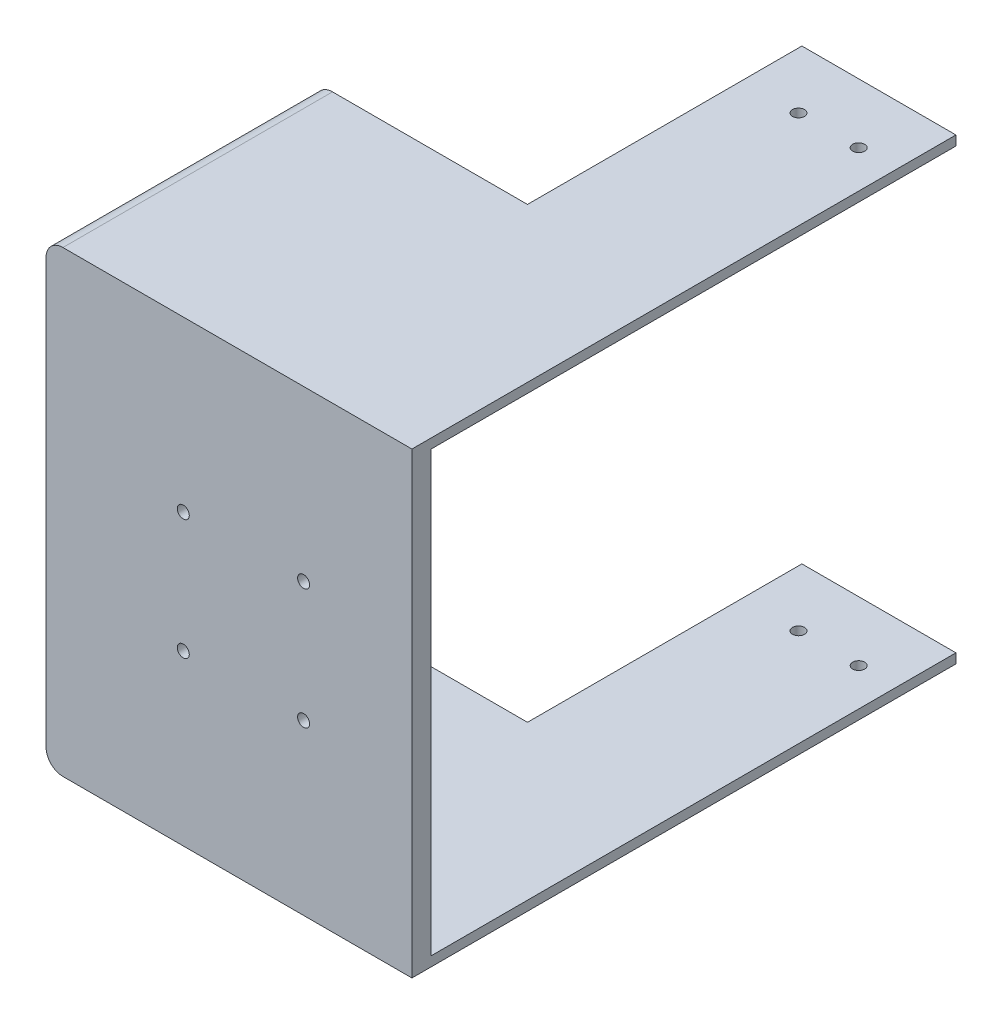
ISO-10303-21;
HEADER;
FILE_DESCRIPTION(('STEP AP214'),'2;1');
FILE_NAME('part.step','',(''),(''),'','','');
FILE_SCHEMA(('AUTOMOTIVE_DESIGN { 1 0 10303 214 1 1 1 1 }'));
ENDSEC;
DATA;
#1=APPLICATION_CONTEXT('core data for automotive mechanical design processes');
#2=APPLICATION_PROTOCOL_DEFINITION('international standard','automotive_design',2000,#1);
#3=PRODUCT_CONTEXT('',#1,'mechanical');
#4=PRODUCT('Part','Part','',(#3));
#5=PRODUCT_RELATED_PRODUCT_CATEGORY('part','',(#4));
#6=PRODUCT_DEFINITION_FORMATION('','',#4);
#7=PRODUCT_DEFINITION_CONTEXT('part definition',#1,'design');
#8=PRODUCT_DEFINITION('design','',#6,#7);
#9=PRODUCT_DEFINITION_SHAPE('','',#8);
#10=(LENGTH_UNIT() NAMED_UNIT(*) SI_UNIT(.MILLI.,.METRE.));
#11=(NAMED_UNIT(*) PLANE_ANGLE_UNIT() SI_UNIT($,.RADIAN.));
#12=(NAMED_UNIT(*) SI_UNIT($,.STERADIAN.) SOLID_ANGLE_UNIT());
#13=UNCERTAINTY_MEASURE_WITH_UNIT(LENGTH_MEASURE(1.E-05),#10,'distance_accuracy_value','');
#14=(GEOMETRIC_REPRESENTATION_CONTEXT(3) GLOBAL_UNCERTAINTY_ASSIGNED_CONTEXT((#13)) GLOBAL_UNIT_ASSIGNED_CONTEXT((#10,
#11,#12)) REPRESENTATION_CONTEXT('',''));
#15=CARTESIAN_POINT('',(0.,0.,0.));
#16=DIRECTION('',(0.,0.,1.));
#17=DIRECTION('',(1.,0.,0.));
#18=AXIS2_PLACEMENT_3D('',#15,#16,#17);
#19=CARTESIAN_POINT('',(42.,47.58,-56.));
#20=DIRECTION('',(0.,0.,1.));
#21=DIRECTION('',(0.,-1.,0.));
#22=AXIS2_PLACEMENT_3D('',#19,#20,#21);
#23=PLANE('',#22);
#24=DIRECTION('',(-1.,0.,0.));
#25=VECTOR('',#24,1.);
#26=CARTESIAN_POINT('',(42.,-47.58,-56.));
#27=LINE('',#26,#25);
#28=CARTESIAN_POINT('',(42.,-47.58,-56.));
#29=VERTEX_POINT('',#28);
#30=CARTESIAN_POINT('',(1.50000000000002,-47.58,-56.));
#31=VERTEX_POINT('',#30);
#32=EDGE_CURVE('E178',#29,#31,#27,.T.);
#33=ORIENTED_EDGE('',*,*,#32,.T.);
#34=DIRECTION('',(0.,1.,0.));
#35=VECTOR('',#34,1.);
#36=CARTESIAN_POINT('',(1.50000000000002,-47.58,-56.));
#37=LINE('',#36,#35);
#38=CARTESIAN_POINT('',(1.50000000000001,-45.58,-56.));
#39=VERTEX_POINT('',#38);
#40=EDGE_CURVE('E11',#31,#39,#37,.T.);
#41=ORIENTED_EDGE('',*,*,#40,.T.);
#42=DIRECTION('',(-1.,0.,0.));
#43=VECTOR('',#42,1.);
#44=CARTESIAN_POINT('',(0.,-45.58,-56.));
#45=LINE('',#44,#43);
#46=CARTESIAN_POINT('',(42.,-45.58,-56.));
#47=VERTEX_POINT('',#46);
#48=EDGE_CURVE('E181',#47,#39,#45,.T.);
#49=ORIENTED_EDGE('',*,*,#48,.F.);
#50=DIRECTION('',(0.,1.,0.));
#51=VECTOR('',#50,1.);
#52=CARTESIAN_POINT('',(42.,47.58,-56.));
#53=LINE('',#52,#51);
#54=EDGE_CURVE('E168',#29,#47,#53,.T.);
#55=ORIENTED_EDGE('',*,*,#54,.F.);
#56=EDGE_LOOP('',(#33,#41,#49,#55));
#57=FACE_BOUND('',#56,.T.);
#58=ADVANCED_FACE('F40',(#57),#23,.F.);
#59=DIRECTION('',(0.,1.,0.));
#60=VECTOR('',#59,1.);
#61=CARTESIAN_POINT('',(0.,45.58,-56.));
#62=LINE('',#61,#60);
#63=CARTESIAN_POINT('',(0.,-44.08,-56.));
#64=VERTEX_POINT('',#63);
#65=CARTESIAN_POINT('',(0.,44.08,-56.));
#66=VERTEX_POINT('',#65);
#67=EDGE_CURVE('E212',#64,#66,#62,.T.);
#68=ORIENTED_EDGE('',*,*,#67,.F.);
#69=DIRECTION('',(-1.,0.,0.));
#70=VECTOR('',#69,1.);
#71=CARTESIAN_POINT('',(0.,-44.08,-56.));
#72=LINE('',#71,#70);
#73=CARTESIAN_POINT('',(-1.99999999999999,-44.08,-56.));
#74=VERTEX_POINT('',#73);
#75=EDGE_CURVE('E48',#64,#74,#72,.T.);
#76=ORIENTED_EDGE('',*,*,#75,.T.);
#77=DIRECTION('',(0.,1.,0.));
#78=VECTOR('',#77,1.);
#79=CARTESIAN_POINT('',(-2.00000000000002,47.58,-56.));
#80=LINE('',#79,#78);
#81=CARTESIAN_POINT('',(-2.00000000000002,44.08,-56.));
#82=VERTEX_POINT('',#81);
#83=EDGE_CURVE('E174',#74,#82,#80,.T.);
#84=ORIENTED_EDGE('',*,*,#83,.T.);
#85=DIRECTION('',(1.,0.,0.));
#86=VECTOR('',#85,1.);
#87=CARTESIAN_POINT('',(-2.00000000000002,44.08,-56.));
#88=LINE('',#87,#86);
#89=EDGE_CURVE('E330',#82,#66,#88,.T.);
#90=ORIENTED_EDGE('',*,*,#89,.T.);
#91=EDGE_LOOP('',(#68,#76,#84,#90));
#92=FACE_BOUND('',#91,.T.);
#93=ADVANCED_FACE('F334',(#92),#23,.F.);
#94=ORIENTED_EDGE('',*,*,#40,.F.);
#95=CARTESIAN_POINT('',(1.50000000000001,-44.08,-56.));
#96=DIRECTION('',(0.,0.,1.));
#97=DIRECTION('',(0.,-1.,0.));
#98=AXIS2_PLACEMENT_3D('',#95,#96,#97);
#99=CIRCLE('',#98,3.5);
#100=EDGE_CURVE('E205',#31,#74,#99,.F.);
#101=ORIENTED_EDGE('',*,*,#100,.T.);
#102=ORIENTED_EDGE('',*,*,#75,.F.);
#103=CARTESIAN_POINT('',(1.50000000000001,-44.08,-56.));
#104=DIRECTION('',(0.,0.,1.));
#105=DIRECTION('',(0.,-1.,0.));
#106=AXIS2_PLACEMENT_3D('',#103,#104,#105);
#107=CIRCLE('',#106,1.5);
#108=EDGE_CURVE('E209',#39,#64,#107,.F.);
#109=ORIENTED_EDGE('',*,*,#108,.F.);
#110=EDGE_LOOP('',(#94,#101,#102,#109));
#111=FACE_BOUND('',#110,.T.);
#112=ADVANCED_FACE('F339',(#111),#23,.F.);
#113=DIRECTION('',(1.,0.,0.));
#114=VECTOR('',#113,1.);
#115=CARTESIAN_POINT('',(0.,45.58,-56.));
#116=LINE('',#115,#114);
#117=CARTESIAN_POINT('',(1.49999999999998,45.58,-56.));
#118=VERTEX_POINT('',#117);
#119=CARTESIAN_POINT('',(42.,45.58,-56.));
#120=VERTEX_POINT('',#119);
#121=EDGE_CURVE('E218',#118,#120,#116,.T.);
#122=ORIENTED_EDGE('',*,*,#121,.F.);
#123=DIRECTION('',(0.,1.,0.));
#124=VECTOR('',#123,1.);
#125=CARTESIAN_POINT('',(1.49999999999998,45.58,-56.));
#126=LINE('',#125,#124);
#127=CARTESIAN_POINT('',(1.49999999999999,47.58,-56.));
#128=VERTEX_POINT('',#127);
#129=EDGE_CURVE('E328',#118,#128,#126,.T.);
#130=ORIENTED_EDGE('',*,*,#129,.T.);
#131=DIRECTION('',(-1.,0.,0.));
#132=VECTOR('',#131,1.);
#133=CARTESIAN_POINT('',(42.,47.58,-56.));
#134=LINE('',#133,#132);
#135=CARTESIAN_POINT('',(42.,47.58,-56.));
#136=VERTEX_POINT('',#135);
#137=EDGE_CURVE('E189',#136,#128,#134,.T.);
#138=ORIENTED_EDGE('',*,*,#137,.F.);
#139=EDGE_CURVE('E173',#120,#136,#53,.T.);
#140=ORIENTED_EDGE('',*,*,#139,.F.);
#141=EDGE_LOOP('',(#122,#130,#138,#140));
#142=FACE_BOUND('',#141,.T.);
#143=ADVANCED_FACE('F368',(#142),#23,.F.);
#144=CARTESIAN_POINT('',(0.,45.58,-113.));
#145=DIRECTION('',(0.,1.,0.));
#146=DIRECTION('',(0.,0.,1.));
#147=AXIS2_PLACEMENT_3D('',#144,#145,#146);
#148=PLANE('',#147);
#149=CARTESIAN_POINT('',(53.7,45.58,-100.6));
#150=DIRECTION('',(0.,1.,0.));
#151=DIRECTION('',(0.,0.,1.));
#152=AXIS2_PLACEMENT_3D('',#149,#150,#151);
#153=CIRCLE('',#152,1.24999999999999);
#154=CARTESIAN_POINT('',(53.7,45.58,-99.35));
#155=VERTEX_POINT('',#154);
#156=EDGE_CURVE('E230',#155,#155,#153,.T.);
#157=ORIENTED_EDGE('',*,*,#156,.T.);
#158=EDGE_LOOP('',(#157));
#159=FACE_BOUND('',#158,.T.);
#160=CARTESIAN_POINT('',(66.2,45.58,-100.6));
#161=DIRECTION('',(0.,1.,0.));
#162=DIRECTION('',(0.,0.,1.));
#163=AXIS2_PLACEMENT_3D('',#160,#161,#162);
#164=CIRCLE('',#163,1.24999999999999);
#165=CARTESIAN_POINT('',(66.2,45.58,-99.35));
#166=VERTEX_POINT('',#165);
#167=EDGE_CURVE('E242',#166,#166,#164,.T.);
#168=ORIENTED_EDGE('',*,*,#167,.T.);
#169=EDGE_LOOP('',(#168));
#170=FACE_BOUND('',#169,.T.);
#171=DIRECTION('',(0.,0.,1.));
#172=VECTOR('',#171,1.);
#173=CARTESIAN_POINT('',(1.49999999999998,45.58,-113.));
#174=LINE('',#173,#172);
#175=CARTESIAN_POINT('',(1.49999999999998,45.58,-4.));
#176=VERTEX_POINT('',#175);
#177=EDGE_CURVE('E305',#118,#176,#174,.T.);
#178=ORIENTED_EDGE('',*,*,#177,.F.);
#179=ORIENTED_EDGE('',*,*,#121,.T.);
#180=DIRECTION('',(0.,0.,-1.));
#181=VECTOR('',#180,1.);
#182=CARTESIAN_POINT('',(42.,45.58,-113.));
#183=LINE('',#182,#181);
#184=CARTESIAN_POINT('',(42.,45.58,-113.));
#185=VERTEX_POINT('',#184);
#186=EDGE_CURVE('E199',#120,#185,#183,.T.);
#187=ORIENTED_EDGE('',*,*,#186,.T.);
#188=DIRECTION('',(-1.,0.,0.));
#189=VECTOR('',#188,1.);
#190=CARTESIAN_POINT('',(0.,45.58,-113.));
#191=LINE('',#190,#189);
#192=CARTESIAN_POINT('',(74.,45.58,-113.));
#193=VERTEX_POINT('',#192);
#194=EDGE_CURVE('E270',#193,#185,#191,.T.);
#195=ORIENTED_EDGE('',*,*,#194,.F.);
#196=DIRECTION('',(0.,0.,1.));
#197=VECTOR('',#196,1.);
#198=CARTESIAN_POINT('',(74.,45.58,-113.));
#199=LINE('',#198,#197);
#200=CARTESIAN_POINT('',(74.,45.58,-4.));
#201=VERTEX_POINT('',#200);
#202=EDGE_CURVE('E63',#193,#201,#199,.T.);
#203=ORIENTED_EDGE('',*,*,#202,.T.);
#204=DIRECTION('',(-1.,0.,0.));
#205=VECTOR('',#204,1.);
#206=CARTESIAN_POINT('',(74.,45.58,-4.));
#207=LINE('',#206,#205);
#208=EDGE_CURVE('E248',#201,#176,#207,.T.);
#209=ORIENTED_EDGE('',*,*,#208,.T.);
#210=EDGE_LOOP('',(#178,#179,#187,#195,#203,#209));
#211=FACE_BOUND('',#210,.T.);
#212=ADVANCED_FACE('F404',(#159,#170,#211),#148,.F.);
#213=CARTESIAN_POINT('',(1.49999999999998,44.08,-113.));
#214=DIRECTION('',(0.,0.,1.));
#215=DIRECTION('',(1.,0.,0.));
#216=AXIS2_PLACEMENT_3D('',#213,#214,#215);
#217=CYLINDRICAL_SURFACE('',#216,1.5);
#218=DIRECTION('',(0.,0.,1.));
#219=VECTOR('',#218,1.);
#220=CARTESIAN_POINT('',(0.,44.08,-113.));
#221=LINE('',#220,#219);
#222=CARTESIAN_POINT('',(0.,44.08,-4.));
#223=VERTEX_POINT('',#222);
#224=EDGE_CURVE('E307',#66,#223,#221,.T.);
#225=ORIENTED_EDGE('',*,*,#224,.F.);
#226=CARTESIAN_POINT('',(1.49999999999998,44.08,-56.));
#227=DIRECTION('',(0.,0.,1.));
#228=DIRECTION('',(0.,-1.,0.));
#229=AXIS2_PLACEMENT_3D('',#226,#227,#228);
#230=CIRCLE('',#229,1.5);
#231=EDGE_CURVE('E215',#66,#118,#230,.F.);
#232=ORIENTED_EDGE('',*,*,#231,.T.);
#233=ORIENTED_EDGE('',*,*,#177,.T.);
#234=CARTESIAN_POINT('',(1.49999999999998,44.08,-4.));
#235=DIRECTION('',(0.,0.,1.));
#236=DIRECTION('',(1.,0.,0.));
#237=AXIS2_PLACEMENT_3D('',#234,#235,#236);
#238=CIRCLE('',#237,1.5);
#239=EDGE_CURVE('E250',#176,#223,#238,.T.);
#240=ORIENTED_EDGE('',*,*,#239,.T.);
#241=EDGE_LOOP('',(#225,#232,#233,#240));
#242=FACE_BOUND('',#241,.T.);
#243=ADVANCED_FACE('F378',(#242),#217,.F.);
#244=CARTESIAN_POINT('',(0.,45.58,-113.));
#245=DIRECTION('',(-1.,0.,0.));
#246=DIRECTION('',(0.,-1.,0.));
#247=AXIS2_PLACEMENT_3D('',#244,#245,#246);
#248=PLANE('',#247);
#249=DIRECTION('',(0.,0.,1.));
#250=VECTOR('',#249,1.);
#251=CARTESIAN_POINT('',(0.,-44.08,-113.));
#252=LINE('',#251,#250);
#253=CARTESIAN_POINT('',(0.,-44.08,-4.));
#254=VERTEX_POINT('',#253);
#255=EDGE_CURVE('E309',#64,#254,#252,.T.);
#256=ORIENTED_EDGE('',*,*,#255,.F.);
#257=ORIENTED_EDGE('',*,*,#67,.T.);
#258=ORIENTED_EDGE('',*,*,#224,.T.);
#259=DIRECTION('',(0.,-1.,0.));
#260=VECTOR('',#259,1.);
#261=CARTESIAN_POINT('',(0.,44.08,-4.));
#262=LINE('',#261,#260);
#263=EDGE_CURVE('E253',#223,#254,#262,.T.);
#264=ORIENTED_EDGE('',*,*,#263,.T.);
#265=EDGE_LOOP('',(#256,#257,#258,#264));
#266=FACE_BOUND('',#265,.T.);
#267=ADVANCED_FACE('F377',(#266),#248,.F.);
#268=CARTESIAN_POINT('',(1.50000000000001,-44.08,-113.));
#269=DIRECTION('',(0.,0.,1.));
#270=DIRECTION('',(1.,0.,0.));
#271=AXIS2_PLACEMENT_3D('',#268,#269,#270);
#272=CYLINDRICAL_SURFACE('',#271,1.5);
#273=DIRECTION('',(0.,0.,1.));
#274=VECTOR('',#273,1.);
#275=CARTESIAN_POINT('',(1.50000000000001,-45.58,-113.));
#276=LINE('',#275,#274);
#277=CARTESIAN_POINT('',(1.50000000000001,-45.58,-4.));
#278=VERTEX_POINT('',#277);
#279=EDGE_CURVE('E311',#39,#278,#276,.T.);
#280=ORIENTED_EDGE('',*,*,#279,.F.);
#281=ORIENTED_EDGE('',*,*,#108,.T.);
#282=ORIENTED_EDGE('',*,*,#255,.T.);
#283=CARTESIAN_POINT('',(1.50000000000001,-44.08,-4.));
#284=DIRECTION('',(0.,0.,1.));
#285=DIRECTION('',(1.,0.,0.));
#286=AXIS2_PLACEMENT_3D('',#283,#284,#285);
#287=CIRCLE('',#286,1.5);
#288=EDGE_CURVE('E256',#254,#278,#287,.T.);
#289=ORIENTED_EDGE('',*,*,#288,.T.);
#290=EDGE_LOOP('',(#280,#281,#282,#289));
#291=FACE_BOUND('',#290,.T.);
#292=ADVANCED_FACE('F388',(#291),#272,.F.);
#293=CARTESIAN_POINT('',(0.,-45.58,-113.));
#294=DIRECTION('',(0.,-1.,0.));
#295=DIRECTION('',(0.,0.,-1.));
#296=AXIS2_PLACEMENT_3D('',#293,#294,#295);
#297=PLANE('',#296);
#298=CARTESIAN_POINT('',(53.7,-45.58,-100.6));
#299=DIRECTION('',(0.,-1.,0.));
#300=DIRECTION('',(0.,0.,-1.));
#301=AXIS2_PLACEMENT_3D('',#298,#299,#300);
#302=CIRCLE('',#301,1.24999999999999);
#303=CARTESIAN_POINT('',(53.7,-45.58,-101.85));
#304=VERTEX_POINT('',#303);
#305=EDGE_CURVE('E227',#304,#304,#302,.T.);
#306=ORIENTED_EDGE('',*,*,#305,.T.);
#307=EDGE_LOOP('',(#306));
#308=FACE_BOUND('',#307,.T.);
#309=CARTESIAN_POINT('',(66.2,-45.58,-100.6));
#310=DIRECTION('',(0.,-1.,0.));
#311=DIRECTION('',(0.,0.,-1.));
#312=AXIS2_PLACEMENT_3D('',#309,#310,#311);
#313=CIRCLE('',#312,1.24999999999999);
#314=CARTESIAN_POINT('',(66.2,-45.58,-101.85));
#315=VERTEX_POINT('',#314);
#316=EDGE_CURVE('E239',#315,#315,#313,.T.);
#317=ORIENTED_EDGE('',*,*,#316,.T.);
#318=EDGE_LOOP('',(#317));
#319=FACE_BOUND('',#318,.T.);
#320=DIRECTION('',(0.,0.,1.));
#321=VECTOR('',#320,1.);
#322=CARTESIAN_POINT('',(42.,-45.58,-113.));
#323=LINE('',#322,#321);
#324=CARTESIAN_POINT('',(42.,-45.58,-113.));
#325=VERTEX_POINT('',#324);
#326=EDGE_CURVE('E55',#325,#47,#323,.T.);
#327=ORIENTED_EDGE('',*,*,#326,.T.);
#328=ORIENTED_EDGE('',*,*,#48,.T.);
#329=ORIENTED_EDGE('',*,*,#279,.T.);
#330=DIRECTION('',(1.,0.,0.));
#331=VECTOR('',#330,1.);
#332=CARTESIAN_POINT('',(1.50000000000001,-45.58,-4.));
#333=LINE('',#332,#331);
#334=CARTESIAN_POINT('',(74.,-45.58,-4.));
#335=VERTEX_POINT('',#334);
#336=EDGE_CURVE('E259',#278,#335,#333,.T.);
#337=ORIENTED_EDGE('',*,*,#336,.T.);
#338=DIRECTION('',(0.,0.,1.));
#339=VECTOR('',#338,1.);
#340=CARTESIAN_POINT('',(74.,-45.58,-113.));
#341=LINE('',#340,#339);
#342=CARTESIAN_POINT('',(74.,-45.58,-113.));
#343=VERTEX_POINT('',#342);
#344=EDGE_CURVE('E313',#343,#335,#341,.T.);
#345=ORIENTED_EDGE('',*,*,#344,.F.);
#346=DIRECTION('',(1.,0.,0.));
#347=VECTOR('',#346,1.);
#348=CARTESIAN_POINT('',(0.,-45.58,-113.));
#349=LINE('',#348,#347);
#350=EDGE_CURVE('E268',#325,#343,#349,.T.);
#351=ORIENTED_EDGE('',*,*,#350,.F.);
#352=EDGE_LOOP('',(#327,#328,#329,#337,#345,#351));
#353=FACE_BOUND('',#352,.T.);
#354=ADVANCED_FACE('F390',(#308,#319,#353),#297,.F.);
#355=CARTESIAN_POINT('',(-2.00000000000002,44.08,-113.));
#356=DIRECTION('',(0.,0.,-1.));
#357=DIRECTION('',(-1.,0.,0.));
#358=AXIS2_PLACEMENT_3D('',#355,#356,#357);
#359=PLANE('',#358);
#360=DIRECTION('',(0.,-1.,0.));
#361=VECTOR('',#360,1.);
#362=CARTESIAN_POINT('',(42.,44.08,-113.));
#363=LINE('',#362,#361);
#364=CARTESIAN_POINT('',(42.,47.58,-113.));
#365=VERTEX_POINT('',#364);
#366=EDGE_CURVE('E197',#365,#185,#363,.T.);
#367=ORIENTED_EDGE('',*,*,#366,.F.);
#368=DIRECTION('',(1.,0.,0.));
#369=VECTOR('',#368,1.);
#370=CARTESIAN_POINT('',(0.,47.58,-113.));
#371=LINE('',#370,#369);
#372=CARTESIAN_POINT('',(74.,47.58,-113.));
#373=VERTEX_POINT('',#372);
#374=EDGE_CURVE('E275',#373,#365,#371,.F.);
#375=ORIENTED_EDGE('',*,*,#374,.F.);
#376=DIRECTION('',(0.,-1.,0.));
#377=VECTOR('',#376,1.);
#378=CARTESIAN_POINT('',(74.,47.58,-113.));
#379=LINE('',#378,#377);
#380=EDGE_CURVE('E273',#373,#193,#379,.T.);
#381=ORIENTED_EDGE('',*,*,#380,.T.);
#382=ORIENTED_EDGE('',*,*,#194,.T.);
#383=EDGE_LOOP('',(#367,#375,#381,#382));
#384=FACE_BOUND('',#383,.T.);
#385=ADVANCED_FACE('F42',(#384),#359,.T.);
#386=CARTESIAN_POINT('',(0.,-47.58,-113.));
#387=DIRECTION('',(0.,-1.,0.));
#388=DIRECTION('',(0.,0.,-1.));
#389=AXIS2_PLACEMENT_3D('',#386,#387,#388);
#390=PLANE('',#389);
#391=ORIENTED_EDGE('',*,*,#32,.F.);
#392=DIRECTION('',(0.,0.,1.));
#393=VECTOR('',#392,1.);
#394=CARTESIAN_POINT('',(42.,-47.58,-56.));
#395=LINE('',#394,#393);
#396=CARTESIAN_POINT('',(42.,-47.58,-113.));
#397=VERTEX_POINT('',#396);
#398=EDGE_CURVE('E165',#397,#29,#395,.T.);
#399=ORIENTED_EDGE('',*,*,#398,.F.);
#400=DIRECTION('',(1.,0.,0.));
#401=VECTOR('',#400,1.);
#402=CARTESIAN_POINT('',(0.,-47.58,-113.));
#403=LINE('',#402,#401);
#404=CARTESIAN_POINT('',(74.,-47.58,-113.));
#405=VERTEX_POINT('',#404);
#406=EDGE_CURVE('E262',#397,#405,#403,.T.);
#407=ORIENTED_EDGE('',*,*,#406,.T.);
#408=DIRECTION('',(0.,0.,1.));
#409=VECTOR('',#408,1.);
#410=CARTESIAN_POINT('',(74.,-47.58,-113.));
#411=LINE('',#410,#409);
#412=CARTESIAN_POINT('',(74.,-47.58,0.));
#413=VERTEX_POINT('',#412);
#414=EDGE_CURVE('E278',#405,#413,#411,.T.);
#415=ORIENTED_EDGE('',*,*,#414,.T.);
#416=DIRECTION('',(1.,0.,0.));
#417=VECTOR('',#416,1.);
#418=CARTESIAN_POINT('',(0.,-47.58,0.));
#419=LINE('',#418,#417);
#420=CARTESIAN_POINT('',(1.50000000000001,-47.58,0.));
#421=VERTEX_POINT('',#420);
#422=EDGE_CURVE('E261',#421,#413,#419,.T.);
#423=ORIENTED_EDGE('',*,*,#422,.F.);
#424=DIRECTION('',(0.,0.,1.));
#425=VECTOR('',#424,1.);
#426=CARTESIAN_POINT('',(1.50000000000001,-47.58,-113.));
#427=LINE('',#426,#425);
#428=EDGE_CURVE('E188',#31,#421,#427,.T.);
#429=ORIENTED_EDGE('',*,*,#428,.F.);
#430=EDGE_LOOP('',(#391,#399,#407,#415,#423,#429));
#431=FACE_BOUND('',#430,.T.);
#432=CARTESIAN_POINT('',(53.7,-47.58,-100.6));
#433=DIRECTION('',(0.,1.,0.));
#434=DIRECTION('',(0.,0.,1.));
#435=AXIS2_PLACEMENT_3D('',#432,#433,#434);
#436=CIRCLE('',#435,1.24999999999999);
#437=CARTESIAN_POINT('',(53.7,-47.58,-99.35));
#438=VERTEX_POINT('',#437);
#439=EDGE_CURVE('E224',#438,#438,#436,.T.);
#440=ORIENTED_EDGE('',*,*,#439,.T.);
#441=EDGE_LOOP('',(#440));
#442=FACE_BOUND('',#441,.T.);
#443=CARTESIAN_POINT('',(66.2,-47.58,-100.6));
#444=DIRECTION('',(0.,1.,0.));
#445=DIRECTION('',(0.,0.,1.));
#446=AXIS2_PLACEMENT_3D('',#443,#444,#445);
#447=CIRCLE('',#446,1.24999999999999);
#448=CARTESIAN_POINT('',(66.2,-47.58,-99.35));
#449=VERTEX_POINT('',#448);
#450=EDGE_CURVE('E236',#449,#449,#447,.T.);
#451=ORIENTED_EDGE('',*,*,#450,.T.);
#452=EDGE_LOOP('',(#451));
#453=FACE_BOUND('',#452,.T.);
#454=ADVANCED_FACE('F185',(#431,#442,#453),#390,.T.);
#455=CARTESIAN_POINT('',(1.50000000000001,-44.08,-113.));
#456=DIRECTION('',(0.,0.,1.));
#457=DIRECTION('',(1.,0.,0.));
#458=AXIS2_PLACEMENT_3D('',#455,#456,#457);
#459=CYLINDRICAL_SURFACE('',#458,3.5);
#460=ORIENTED_EDGE('',*,*,#100,.F.);
#461=ORIENTED_EDGE('',*,*,#428,.T.);
#462=CARTESIAN_POINT('',(1.50000000000001,-44.08,0.));
#463=DIRECTION('',(0.,0.,1.));
#464=DIRECTION('',(1.,0.,0.));
#465=AXIS2_PLACEMENT_3D('',#462,#463,#464);
#466=CIRCLE('',#465,3.5);
#467=CARTESIAN_POINT('',(-1.99999999999999,-44.08,0.));
#468=VERTEX_POINT('',#467);
#469=EDGE_CURVE('E265',#468,#421,#466,.T.);
#470=ORIENTED_EDGE('',*,*,#469,.F.);
#471=DIRECTION('',(0.,0.,1.));
#472=VECTOR('',#471,1.);
#473=CARTESIAN_POINT('',(-1.99999999999999,-44.08,-113.));
#474=LINE('',#473,#472);
#475=EDGE_CURVE('E296',#74,#468,#474,.T.);
#476=ORIENTED_EDGE('',*,*,#475,.F.);
#477=EDGE_LOOP('',(#460,#461,#470,#476));
#478=FACE_BOUND('',#477,.T.);
#479=ADVANCED_FACE('F349',(#478),#459,.T.);
#480=CARTESIAN_POINT('',(-2.00000000000002,45.58,-113.));
#481=DIRECTION('',(-1.,0.,0.));
#482=DIRECTION('',(0.,-1.,0.));
#483=AXIS2_PLACEMENT_3D('',#480,#481,#482);
#484=PLANE('',#483);
#485=ORIENTED_EDGE('',*,*,#83,.F.);
#486=ORIENTED_EDGE('',*,*,#475,.T.);
#487=DIRECTION('',(0.,-1.,0.));
#488=VECTOR('',#487,1.);
#489=CARTESIAN_POINT('',(-2.00000000000002,45.58,0.));
#490=LINE('',#489,#488);
#491=CARTESIAN_POINT('',(-2.00000000000002,44.08,0.));
#492=VERTEX_POINT('',#491);
#493=EDGE_CURVE('E289',#492,#468,#490,.T.);
#494=ORIENTED_EDGE('',*,*,#493,.F.);
#495=DIRECTION('',(0.,0.,1.));
#496=VECTOR('',#495,1.);
#497=CARTESIAN_POINT('',(-2.00000000000002,44.08,-113.));
#498=LINE('',#497,#496);
#499=EDGE_CURVE('E298',#82,#492,#498,.T.);
#500=ORIENTED_EDGE('',*,*,#499,.F.);
#501=EDGE_LOOP('',(#485,#486,#494,#500));
#502=FACE_BOUND('',#501,.T.);
#503=ADVANCED_FACE('F344',(#502),#484,.T.);
#504=CARTESIAN_POINT('',(1.49999999999998,44.08,-113.));
#505=DIRECTION('',(0.,0.,1.));
#506=DIRECTION('',(1.,0.,0.));
#507=AXIS2_PLACEMENT_3D('',#504,#505,#506);
#508=CYLINDRICAL_SURFACE('',#507,3.5);
#509=CARTESIAN_POINT('',(1.49999999999998,44.08,-56.));
#510=DIRECTION('',(0.,0.,1.));
#511=DIRECTION('',(0.,-1.,0.));
#512=AXIS2_PLACEMENT_3D('',#509,#510,#511);
#513=CIRCLE('',#512,3.5);
#514=EDGE_CURVE('E202',#82,#128,#513,.F.);
#515=ORIENTED_EDGE('',*,*,#514,.F.);
#516=ORIENTED_EDGE('',*,*,#499,.T.);
#517=CARTESIAN_POINT('',(1.49999999999998,44.08,0.));
#518=DIRECTION('',(0.,0.,1.));
#519=DIRECTION('',(1.,0.,0.));
#520=AXIS2_PLACEMENT_3D('',#517,#518,#519);
#521=CIRCLE('',#520,3.5);
#522=CARTESIAN_POINT('',(1.49999999999998,47.58,0.));
#523=VERTEX_POINT('',#522);
#524=EDGE_CURVE('E286',#523,#492,#521,.T.);
#525=ORIENTED_EDGE('',*,*,#524,.F.);
#526=DIRECTION('',(0.,0.,1.));
#527=VECTOR('',#526,1.);
#528=CARTESIAN_POINT('',(1.49999999999998,47.58,-113.));
#529=LINE('',#528,#527);
#530=EDGE_CURVE('E300',#128,#523,#529,.T.);
#531=ORIENTED_EDGE('',*,*,#530,.F.);
#532=EDGE_LOOP('',(#515,#516,#525,#531));
#533=FACE_BOUND('',#532,.T.);
#534=ADVANCED_FACE('F356',(#533),#508,.T.);
#535=CARTESIAN_POINT('',(0.,47.58,-113.));
#536=DIRECTION('',(0.,1.,0.));
#537=DIRECTION('',(0.,0.,1.));
#538=AXIS2_PLACEMENT_3D('',#535,#536,#537);
#539=PLANE('',#538);
#540=ORIENTED_EDGE('',*,*,#137,.T.);
#541=ORIENTED_EDGE('',*,*,#530,.T.);
#542=DIRECTION('',(1.,0.,0.));
#543=VECTOR('',#542,1.);
#544=CARTESIAN_POINT('',(0.,47.58,0.));
#545=LINE('',#544,#543);
#546=CARTESIAN_POINT('',(74.,47.58,0.));
#547=VERTEX_POINT('',#546);
#548=EDGE_CURVE('E283',#547,#523,#545,.F.);
#549=ORIENTED_EDGE('',*,*,#548,.F.);
#550=DIRECTION('',(0.,0.,1.));
#551=VECTOR('',#550,1.);
#552=CARTESIAN_POINT('',(74.,47.58,-113.));
#553=LINE('',#552,#551);
#554=EDGE_CURVE('E302',#373,#547,#553,.T.);
#555=ORIENTED_EDGE('',*,*,#554,.F.);
#556=ORIENTED_EDGE('',*,*,#374,.T.);
#557=DIRECTION('',(0.,0.,-1.));
#558=VECTOR('',#557,1.);
#559=CARTESIAN_POINT('',(42.,47.58,-127.587494400376));
#560=LINE('',#559,#558);
#561=EDGE_CURVE('E182',#136,#365,#560,.T.);
#562=ORIENTED_EDGE('',*,*,#561,.F.);
#563=EDGE_LOOP('',(#540,#541,#549,#555,#556,#562));
#564=FACE_BOUND('',#563,.T.);
#565=CARTESIAN_POINT('',(53.7,47.58,-100.6));
#566=DIRECTION('',(0.,1.,0.));
#567=DIRECTION('',(0.,0.,1.));
#568=AXIS2_PLACEMENT_3D('',#565,#566,#567);
#569=CIRCLE('',#568,1.24999999999999);
#570=CARTESIAN_POINT('',(53.7,47.58,-99.35));
#571=VERTEX_POINT('',#570);
#572=EDGE_CURVE('E221',#571,#571,#569,.T.);
#573=ORIENTED_EDGE('',*,*,#572,.F.);
#574=EDGE_LOOP('',(#573));
#575=FACE_BOUND('',#574,.T.);
#576=CARTESIAN_POINT('',(66.2,47.58,-100.6));
#577=DIRECTION('',(0.,1.,0.));
#578=DIRECTION('',(0.,0.,1.));
#579=AXIS2_PLACEMENT_3D('',#576,#577,#578);
#580=CIRCLE('',#579,1.24999999999999);
#581=CARTESIAN_POINT('',(66.2,47.58,-99.35));
#582=VERTEX_POINT('',#581);
#583=EDGE_CURVE('E233',#582,#582,#580,.T.);
#584=ORIENTED_EDGE('',*,*,#583,.F.);
#585=EDGE_LOOP('',(#584));
#586=FACE_BOUND('',#585,.T.);
#587=ADVANCED_FACE('F360',(#564,#575,#586),#539,.T.);
#588=CARTESIAN_POINT('',(74.,47.58,-113.));
#589=DIRECTION('',(-1.,0.,0.));
#590=DIRECTION('',(0.,0.,1.));
#591=AXIS2_PLACEMENT_3D('',#588,#589,#590);
#592=PLANE('',#591);
#593=DIRECTION('',(0.,-1.,0.));
#594=VECTOR('',#593,1.);
#595=CARTESIAN_POINT('',(74.,47.58,0.));
#596=LINE('',#595,#594);
#597=EDGE_CURVE('E281',#547,#413,#596,.T.);
#598=ORIENTED_EDGE('',*,*,#597,.T.);
#599=ORIENTED_EDGE('',*,*,#414,.F.);
#600=DIRECTION('',(0.,-1.,0.));
#601=VECTOR('',#600,1.);
#602=CARTESIAN_POINT('',(74.,-45.58,-113.));
#603=LINE('',#602,#601);
#604=EDGE_CURVE('E264',#343,#405,#603,.T.);
#605=ORIENTED_EDGE('',*,*,#604,.F.);
#606=ORIENTED_EDGE('',*,*,#344,.T.);
#607=DIRECTION('',(0.,1.,0.));
#608=VECTOR('',#607,1.);
#609=CARTESIAN_POINT('',(74.,-45.58,-4.));
#610=LINE('',#609,#608);
#611=EDGE_CURVE('E245',#335,#201,#610,.T.);
#612=ORIENTED_EDGE('',*,*,#611,.T.);
#613=ORIENTED_EDGE('',*,*,#202,.F.);
#614=ORIENTED_EDGE('',*,*,#380,.F.);
#615=ORIENTED_EDGE('',*,*,#554,.T.);
#616=EDGE_LOOP('',(#598,#599,#605,#606,#612,#613,#614,#615));
#617=FACE_BOUND('',#616,.T.);
#618=ADVANCED_FACE('F398',(#617),#592,.F.);
#619=CARTESIAN_POINT('',(1.50000000000001,-44.08,-113.));
#620=DIRECTION('',(0.,0.,-1.));
#621=DIRECTION('',(-1.,0.,0.));
#622=AXIS2_PLACEMENT_3D('',#619,#620,#621);
#623=PLANE('',#622);
#624=DIRECTION('',(0.,-1.,0.));
#625=VECTOR('',#624,1.);
#626=CARTESIAN_POINT('',(42.,-44.08,-113.));
#627=LINE('',#626,#625);
#628=EDGE_CURVE('E169',#325,#397,#627,.T.);
#629=ORIENTED_EDGE('',*,*,#628,.F.);
#630=ORIENTED_EDGE('',*,*,#350,.T.);
#631=ORIENTED_EDGE('',*,*,#604,.T.);
#632=ORIENTED_EDGE('',*,*,#406,.F.);
#633=EDGE_LOOP('',(#629,#630,#631,#632));
#634=FACE_BOUND('',#633,.T.);
#635=ADVANCED_FACE('F395',(#634),#623,.T.);
#636=CARTESIAN_POINT('',(1.50000000000001,-44.08,0.));
#637=DIRECTION('',(0.,0.,-1.));
#638=DIRECTION('',(-1.,0.,0.));
#639=AXIS2_PLACEMENT_3D('',#636,#637,#638);
#640=PLANE('',#639);
#641=CARTESIAN_POINT('',(51.5,12.5,0.));
#642=DIRECTION('',(0.,0.,-1.));
#643=DIRECTION('',(-1.,0.,0.));
#644=AXIS2_PLACEMENT_3D('',#641,#642,#643);
#645=CIRCLE('',#644,1.25);
#646=CARTESIAN_POINT('',(50.25,12.5,0.));
#647=VERTEX_POINT('',#646);
#648=EDGE_CURVE('E619',#647,#647,#645,.T.);
#649=ORIENTED_EDGE('',*,*,#648,.T.);
#650=EDGE_LOOP('',(#649));
#651=FACE_BOUND('',#650,.T.);
#652=CARTESIAN_POINT('',(26.5,12.5,0.));
#653=DIRECTION('',(0.,0.,-1.));
#654=DIRECTION('',(-1.,0.,0.));
#655=AXIS2_PLACEMENT_3D('',#652,#653,#654);
#656=CIRCLE('',#655,1.25);
#657=CARTESIAN_POINT('',(25.25,12.5,0.));
#658=VERTEX_POINT('',#657);
#659=EDGE_CURVE('E629',#658,#658,#656,.T.);
#660=ORIENTED_EDGE('',*,*,#659,.T.);
#661=EDGE_LOOP('',(#660));
#662=FACE_BOUND('',#661,.T.);
#663=CARTESIAN_POINT('',(26.5,-12.5,0.));
#664=DIRECTION('',(0.,0.,-1.));
#665=DIRECTION('',(-1.,0.,0.));
#666=AXIS2_PLACEMENT_3D('',#663,#664,#665);
#667=CIRCLE('',#666,1.25);
#668=CARTESIAN_POINT('',(25.25,-12.5,0.));
#669=VERTEX_POINT('',#668);
#670=EDGE_CURVE('E635',#669,#669,#667,.T.);
#671=ORIENTED_EDGE('',*,*,#670,.T.);
#672=EDGE_LOOP('',(#671));
#673=FACE_BOUND('',#672,.T.);
#674=CARTESIAN_POINT('',(51.5,-12.5,0.));
#675=DIRECTION('',(0.,0.,-1.));
#676=DIRECTION('',(-1.,0.,0.));
#677=AXIS2_PLACEMENT_3D('',#674,#675,#676);
#678=CIRCLE('',#677,1.25);
#679=CARTESIAN_POINT('',(50.25,-12.5,0.));
#680=VERTEX_POINT('',#679);
#681=EDGE_CURVE('E347',#680,#680,#678,.T.);
#682=ORIENTED_EDGE('',*,*,#681,.T.);
#683=EDGE_LOOP('',(#682));
#684=FACE_BOUND('',#683,.T.);
#685=ORIENTED_EDGE('',*,*,#422,.T.);
#686=ORIENTED_EDGE('',*,*,#597,.F.);
#687=ORIENTED_EDGE('',*,*,#548,.T.);
#688=ORIENTED_EDGE('',*,*,#524,.T.);
#689=ORIENTED_EDGE('',*,*,#493,.T.);
#690=ORIENTED_EDGE('',*,*,#469,.T.);
#691=EDGE_LOOP('',(#685,#686,#687,#688,#689,#690));
#692=FACE_BOUND('',#691,.T.);
#693=ADVANCED_FACE('F351',(#651,#662,#673,#684,#692),#640,.F.);
#694=CARTESIAN_POINT('',(1.49999999999998,44.08,-4.));
#695=DIRECTION('',(0.,0.,1.));
#696=DIRECTION('',(1.,0.,0.));
#697=AXIS2_PLACEMENT_3D('',#694,#695,#696);
#698=PLANE('',#697);
#699=CARTESIAN_POINT('',(51.5,12.5,-4.));
#700=DIRECTION('',(0.,0.,-1.));
#701=DIRECTION('',(-1.,0.,0.));
#702=AXIS2_PLACEMENT_3D('',#699,#700,#701);
#703=CIRCLE('',#702,1.24999999999999);
#704=CARTESIAN_POINT('',(50.25,12.5,-4.));
#705=VERTEX_POINT('',#704);
#706=EDGE_CURVE('E622',#705,#705,#703,.T.);
#707=ORIENTED_EDGE('',*,*,#706,.F.);
#708=EDGE_LOOP('',(#707));
#709=FACE_BOUND('',#708,.T.);
#710=CARTESIAN_POINT('',(26.5,12.5,-4.));
#711=DIRECTION('',(0.,0.,-1.));
#712=DIRECTION('',(-1.,0.,0.));
#713=AXIS2_PLACEMENT_3D('',#710,#711,#712);
#714=CIRCLE('',#713,1.24999999999999);
#715=CARTESIAN_POINT('',(25.25,12.5,-4.));
#716=VERTEX_POINT('',#715);
#717=EDGE_CURVE('E624',#716,#716,#714,.T.);
#718=ORIENTED_EDGE('',*,*,#717,.F.);
#719=EDGE_LOOP('',(#718));
#720=FACE_BOUND('',#719,.T.);
#721=CARTESIAN_POINT('',(26.5,-12.5,-4.));
#722=DIRECTION('',(0.,0.,-1.));
#723=DIRECTION('',(-1.,0.,0.));
#724=AXIS2_PLACEMENT_3D('',#721,#722,#723);
#725=CIRCLE('',#724,1.24999999999999);
#726=CARTESIAN_POINT('',(25.25,-12.5,-4.));
#727=VERTEX_POINT('',#726);
#728=EDGE_CURVE('E632',#727,#727,#725,.T.);
#729=ORIENTED_EDGE('',*,*,#728,.F.);
#730=EDGE_LOOP('',(#729));
#731=FACE_BOUND('',#730,.T.);
#732=CARTESIAN_POINT('',(51.5,-12.5,-4.));
#733=DIRECTION('',(0.,0.,-1.));
#734=DIRECTION('',(-1.,0.,0.));
#735=AXIS2_PLACEMENT_3D('',#732,#733,#734);
#736=CIRCLE('',#735,1.24999999999999);
#737=CARTESIAN_POINT('',(50.25,-12.5,-4.));
#738=VERTEX_POINT('',#737);
#739=EDGE_CURVE('E638',#738,#738,#736,.T.);
#740=ORIENTED_EDGE('',*,*,#739,.F.);
#741=EDGE_LOOP('',(#740));
#742=FACE_BOUND('',#741,.T.);
#743=ORIENTED_EDGE('',*,*,#611,.F.);
#744=ORIENTED_EDGE('',*,*,#336,.F.);
#745=ORIENTED_EDGE('',*,*,#288,.F.);
#746=ORIENTED_EDGE('',*,*,#263,.F.);
#747=ORIENTED_EDGE('',*,*,#239,.F.);
#748=ORIENTED_EDGE('',*,*,#208,.F.);
#749=EDGE_LOOP('',(#743,#744,#745,#746,#747,#748));
#750=FACE_BOUND('',#749,.T.);
#751=ADVANCED_FACE('F384',(#709,#720,#731,#742,#750),#698,.F.);
#752=CARTESIAN_POINT('',(66.2,47.58,-100.6));
#753=DIRECTION('',(0.,1.,0.));
#754=DIRECTION('',(0.,0.,1.));
#755=AXIS2_PLACEMENT_3D('',#752,#753,#754);
#756=CYLINDRICAL_SURFACE('',#755,1.24999999999999);
#757=ORIENTED_EDGE('',*,*,#583,.T.);
#758=EDGE_LOOP('',(#757));
#759=FACE_BOUND('',#758,.T.);
#760=ORIENTED_EDGE('',*,*,#167,.F.);
#761=EDGE_LOOP('',(#760));
#762=FACE_BOUND('',#761,.T.);
#763=ADVANCED_FACE('F438',(#759,#762),#756,.F.);
#764=ORIENTED_EDGE('',*,*,#450,.F.);
#765=EDGE_LOOP('',(#764));
#766=FACE_BOUND('',#765,.T.);
#767=ORIENTED_EDGE('',*,*,#316,.F.);
#768=EDGE_LOOP('',(#767));
#769=FACE_BOUND('',#768,.T.);
#770=ADVANCED_FACE('F433',(#766,#769),#756,.F.);
#771=CARTESIAN_POINT('',(53.7,47.58,-100.6));
#772=DIRECTION('',(0.,1.,0.));
#773=DIRECTION('',(0.,0.,1.));
#774=AXIS2_PLACEMENT_3D('',#771,#772,#773);
#775=CYLINDRICAL_SURFACE('',#774,1.24999999999999);
#776=ORIENTED_EDGE('',*,*,#572,.T.);
#777=EDGE_LOOP('',(#776));
#778=FACE_BOUND('',#777,.T.);
#779=ORIENTED_EDGE('',*,*,#156,.F.);
#780=EDGE_LOOP('',(#779));
#781=FACE_BOUND('',#780,.T.);
#782=ADVANCED_FACE('F428',(#778,#781),#775,.F.);
#783=ORIENTED_EDGE('',*,*,#439,.F.);
#784=EDGE_LOOP('',(#783));
#785=FACE_BOUND('',#784,.T.);
#786=ORIENTED_EDGE('',*,*,#305,.F.);
#787=EDGE_LOOP('',(#786));
#788=FACE_BOUND('',#787,.T.);
#789=ADVANCED_FACE('F423',(#785,#788),#775,.F.);
#790=ORIENTED_EDGE('',*,*,#89,.F.);
#791=ORIENTED_EDGE('',*,*,#514,.T.);
#792=ORIENTED_EDGE('',*,*,#129,.F.);
#793=ORIENTED_EDGE('',*,*,#231,.F.);
#794=EDGE_LOOP('',(#790,#791,#792,#793));
#795=FACE_BOUND('',#794,.T.);
#796=ADVANCED_FACE('F371',(#795),#23,.F.);
#797=CARTESIAN_POINT('',(42.,0.,0.));
#798=DIRECTION('',(1.,0.,0.));
#799=DIRECTION('',(0.,1.,0.));
#800=AXIS2_PLACEMENT_3D('',#797,#798,#799);
#801=PLANE('',#800);
#802=ORIENTED_EDGE('',*,*,#139,.T.);
#803=ORIENTED_EDGE('',*,*,#561,.T.);
#804=ORIENTED_EDGE('',*,*,#366,.T.);
#805=ORIENTED_EDGE('',*,*,#186,.F.);
#806=EDGE_LOOP('',(#802,#803,#804,#805));
#807=FACE_BOUND('',#806,.T.);
#808=ADVANCED_FACE('F403',(#807),#801,.F.);
#809=ORIENTED_EDGE('',*,*,#628,.T.);
#810=ORIENTED_EDGE('',*,*,#398,.T.);
#811=ORIENTED_EDGE('',*,*,#54,.T.);
#812=ORIENTED_EDGE('',*,*,#326,.F.);
#813=EDGE_LOOP('',(#809,#810,#811,#812));
#814=FACE_BOUND('',#813,.T.);
#815=ADVANCED_FACE('F167',(#814),#801,.F.);
#816=CARTESIAN_POINT('',(51.5,-12.5,-4.));
#817=DIRECTION('',(0.,0.,-1.));
#818=DIRECTION('',(-1.,0.,0.));
#819=AXIS2_PLACEMENT_3D('',#816,#817,#818);
#820=CYLINDRICAL_SURFACE('',#819,1.24999999999999);
#821=ORIENTED_EDGE('',*,*,#681,.F.);
#822=EDGE_LOOP('',(#821));
#823=FACE_BOUND('',#822,.T.);
#824=ORIENTED_EDGE('',*,*,#739,.T.);
#825=EDGE_LOOP('',(#824));
#826=FACE_BOUND('',#825,.T.);
#827=ADVANCED_FACE('F547',(#823,#826),#820,.F.);
#828=CARTESIAN_POINT('',(26.5,-12.5,-4.));
#829=DIRECTION('',(0.,0.,-1.));
#830=DIRECTION('',(-1.,0.,0.));
#831=AXIS2_PLACEMENT_3D('',#828,#829,#830);
#832=CYLINDRICAL_SURFACE('',#831,1.24999999999999);
#833=ORIENTED_EDGE('',*,*,#670,.F.);
#834=EDGE_LOOP('',(#833));
#835=FACE_BOUND('',#834,.T.);
#836=ORIENTED_EDGE('',*,*,#728,.T.);
#837=EDGE_LOOP('',(#836));
#838=FACE_BOUND('',#837,.T.);
#839=ADVANCED_FACE('F555',(#835,#838),#832,.F.);
#840=CARTESIAN_POINT('',(26.5,12.5,-4.));
#841=DIRECTION('',(0.,0.,-1.));
#842=DIRECTION('',(-1.,0.,0.));
#843=AXIS2_PLACEMENT_3D('',#840,#841,#842);
#844=CYLINDRICAL_SURFACE('',#843,1.24999999999999);
#845=ORIENTED_EDGE('',*,*,#659,.F.);
#846=EDGE_LOOP('',(#845));
#847=FACE_BOUND('',#846,.T.);
#848=ORIENTED_EDGE('',*,*,#717,.T.);
#849=EDGE_LOOP('',(#848));
#850=FACE_BOUND('',#849,.T.);
#851=ADVANCED_FACE('F570',(#847,#850),#844,.F.);
#852=CARTESIAN_POINT('',(51.5,12.5,-4.));
#853=DIRECTION('',(0.,0.,-1.));
#854=DIRECTION('',(-1.,0.,0.));
#855=AXIS2_PLACEMENT_3D('',#852,#853,#854);
#856=CYLINDRICAL_SURFACE('',#855,1.24999999999999);
#857=ORIENTED_EDGE('',*,*,#648,.F.);
#858=EDGE_LOOP('',(#857));
#859=FACE_BOUND('',#858,.T.);
#860=ORIENTED_EDGE('',*,*,#706,.T.);
#861=EDGE_LOOP('',(#860));
#862=FACE_BOUND('',#861,.T.);
#863=ADVANCED_FACE('F582',(#859,#862),#856,.F.);
#864=CLOSED_SHELL('',(#58,#93,#112,#143,#212,#243,#267,#292,#354,#385,#454,#479,#503,#534,#587,
#618,#635,#693,#751,#763,#770,#782,#789,#796,#808,#815,#827,#839,#851,#863));
#865=MANIFOLD_SOLID_BREP('B2',#864);
#866=ADVANCED_BREP_SHAPE_REPRESENTATION('',(#18,#865),#14);
#867=SHAPE_DEFINITION_REPRESENTATION(#9,#866);
ENDSEC;
END-ISO-10303-21;
